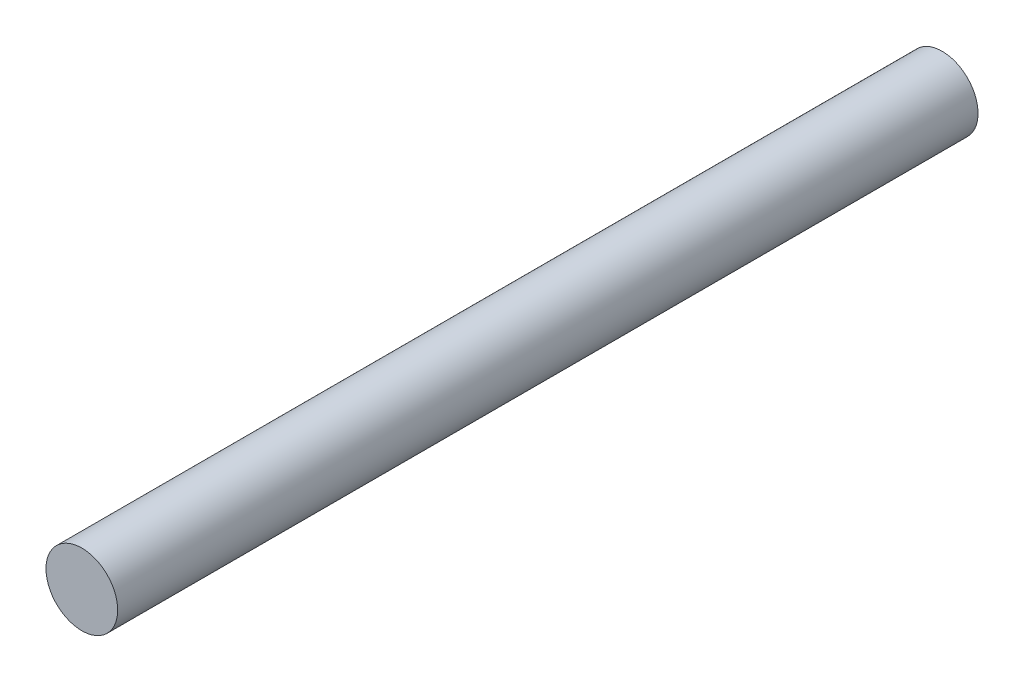
ISO-10303-21;
HEADER;
FILE_DESCRIPTION(('STEP AP214'),'2;1');
FILE_NAME('part.step','',(''),(''),'','','');
FILE_SCHEMA(('AUTOMOTIVE_DESIGN { 1 0 10303 214 1 1 1 1 }'));
ENDSEC;
DATA;
#1=APPLICATION_CONTEXT('core data for automotive mechanical design processes');
#2=APPLICATION_PROTOCOL_DEFINITION('international standard','automotive_design',2000,#1);
#3=PRODUCT_CONTEXT('',#1,'mechanical');
#4=PRODUCT('Part','Part','',(#3));
#5=PRODUCT_RELATED_PRODUCT_CATEGORY('part','',(#4));
#6=PRODUCT_DEFINITION_FORMATION('','',#4);
#7=PRODUCT_DEFINITION_CONTEXT('part definition',#1,'design');
#8=PRODUCT_DEFINITION('design','',#6,#7);
#9=PRODUCT_DEFINITION_SHAPE('','',#8);
#10=(LENGTH_UNIT() NAMED_UNIT(*) SI_UNIT(.MILLI.,.METRE.));
#11=(NAMED_UNIT(*) PLANE_ANGLE_UNIT() SI_UNIT($,.RADIAN.));
#12=(NAMED_UNIT(*) SI_UNIT($,.STERADIAN.) SOLID_ANGLE_UNIT());
#13=UNCERTAINTY_MEASURE_WITH_UNIT(LENGTH_MEASURE(1.E-05),#10,'distance_accuracy_value','');
#14=(GEOMETRIC_REPRESENTATION_CONTEXT(3) GLOBAL_UNCERTAINTY_ASSIGNED_CONTEXT((#13)) GLOBAL_UNIT_ASSIGNED_CONTEXT((#10,
#11,#12)) REPRESENTATION_CONTEXT('',''));
#15=CARTESIAN_POINT('',(0.,0.,0.));
#16=DIRECTION('',(0.,0.,1.));
#17=DIRECTION('',(1.,0.,0.));
#18=AXIS2_PLACEMENT_3D('',#15,#16,#17);
#19=CARTESIAN_POINT('',(0.,0.,42.));
#20=DIRECTION('',(0.,0.,-1.));
#21=DIRECTION('',(-1.,0.,0.));
#22=AXIS2_PLACEMENT_3D('',#19,#20,#21);
#23=CYLINDRICAL_SURFACE('',#22,1.75);
#24=CARTESIAN_POINT('',(0.,0.,42.));
#25=DIRECTION('',(0.,0.,1.));
#26=DIRECTION('',(1.,0.,0.));
#27=AXIS2_PLACEMENT_3D('',#24,#25,#26);
#28=CIRCLE('',#27,1.75);
#29=CARTESIAN_POINT('',(-1.75,0.,42.));
#30=VERTEX_POINT('',#29);
#31=EDGE_CURVE('E10',#30,#30,#28,.T.);
#32=CARTESIAN_POINT('',(0.,0.,0.));
#33=DIRECTION('',(0.,0.,1.));
#34=DIRECTION('',(1.,0.,0.));
#35=AXIS2_PLACEMENT_3D('',#32,#33,#34);
#36=CIRCLE('',#35,1.75);
#37=CARTESIAN_POINT('',(-1.75,0.,0.));
#38=VERTEX_POINT('',#37);
#39=EDGE_CURVE('E38',#38,#38,#36,.T.);
#40=CARTESIAN_POINT('',(-1.75,0.,42.));
#41=CARTESIAN_POINT('',(-1.75,0.,41.5625));
#42=CARTESIAN_POINT('',(-1.75,0.,41.125));
#43=CARTESIAN_POINT('',(-1.75,0.,40.25));
#44=CARTESIAN_POINT('',(-1.75,0.,39.8125));
#45=CARTESIAN_POINT('',(-1.75,0.,38.9375));
#46=CARTESIAN_POINT('',(-1.75,0.,38.5));
#47=CARTESIAN_POINT('',(-1.75,0.,37.625));
#48=CARTESIAN_POINT('',(-1.75,0.,37.1875));
#49=CARTESIAN_POINT('',(-1.75,0.,36.3125));
#50=CARTESIAN_POINT('',(-1.75,0.,35.875));
#51=CARTESIAN_POINT('',(-1.75,0.,35.));
#52=CARTESIAN_POINT('',(-1.75,0.,34.5625));
#53=CARTESIAN_POINT('',(-1.75,0.,33.6875));
#54=CARTESIAN_POINT('',(-1.75,0.,33.25));
#55=CARTESIAN_POINT('',(-1.75,0.,32.375));
#56=CARTESIAN_POINT('',(-1.75,0.,31.9375));
#57=CARTESIAN_POINT('',(-1.75,0.,31.0625));
#58=CARTESIAN_POINT('',(-1.75,0.,30.625));
#59=CARTESIAN_POINT('',(-1.75,0.,29.75));
#60=CARTESIAN_POINT('',(-1.75,0.,29.3125));
#61=CARTESIAN_POINT('',(-1.75,0.,28.4375));
#62=CARTESIAN_POINT('',(-1.75,0.,28.));
#63=CARTESIAN_POINT('',(-1.75,0.,27.125));
#64=CARTESIAN_POINT('',(-1.75,0.,26.6875));
#65=CARTESIAN_POINT('',(-1.75,0.,25.8125));
#66=CARTESIAN_POINT('',(-1.75,0.,25.375));
#67=CARTESIAN_POINT('',(-1.75,0.,24.5));
#68=CARTESIAN_POINT('',(-1.75,0.,24.0625));
#69=CARTESIAN_POINT('',(-1.75,0.,23.1875));
#70=CARTESIAN_POINT('',(-1.75,0.,22.75));
#71=CARTESIAN_POINT('',(-1.75,0.,21.875));
#72=CARTESIAN_POINT('',(-1.75,0.,21.4375));
#73=CARTESIAN_POINT('',(-1.75,0.,20.5625));
#74=CARTESIAN_POINT('',(-1.75,0.,20.125));
#75=CARTESIAN_POINT('',(-1.75,0.,19.25));
#76=CARTESIAN_POINT('',(-1.75,0.,18.8125));
#77=CARTESIAN_POINT('',(-1.75,0.,17.9375));
#78=CARTESIAN_POINT('',(-1.75,0.,17.5));
#79=CARTESIAN_POINT('',(-1.75,0.,16.625));
#80=CARTESIAN_POINT('',(-1.75,0.,16.1875));
#81=CARTESIAN_POINT('',(-1.75,0.,15.3125));
#82=CARTESIAN_POINT('',(-1.75,0.,14.875));
#83=CARTESIAN_POINT('',(-1.75,0.,14.));
#84=CARTESIAN_POINT('',(-1.75,0.,13.5625));
#85=CARTESIAN_POINT('',(-1.75,0.,12.6875));
#86=CARTESIAN_POINT('',(-1.75,0.,12.25));
#87=CARTESIAN_POINT('',(-1.75,0.,11.375));
#88=CARTESIAN_POINT('',(-1.75,0.,10.9375));
#89=CARTESIAN_POINT('',(-1.75,0.,10.0625));
#90=CARTESIAN_POINT('',(-1.75,0.,9.625));
#91=CARTESIAN_POINT('',(-1.75,0.,8.75));
#92=CARTESIAN_POINT('',(-1.75,0.,8.3125));
#93=CARTESIAN_POINT('',(-1.75,0.,7.4375));
#94=CARTESIAN_POINT('',(-1.75,0.,7.));
#95=CARTESIAN_POINT('',(-1.75,0.,6.125));
#96=CARTESIAN_POINT('',(-1.75,0.,5.6875));
#97=CARTESIAN_POINT('',(-1.75,0.,4.8125));
#98=CARTESIAN_POINT('',(-1.75,0.,4.375));
#99=CARTESIAN_POINT('',(-1.75,0.,3.5));
#100=CARTESIAN_POINT('',(-1.75,0.,3.0625));
#101=CARTESIAN_POINT('',(-1.75,0.,2.1875));
#102=CARTESIAN_POINT('',(-1.75,0.,1.75));
#103=CARTESIAN_POINT('',(-1.75,0.,0.875000000000001));
#104=CARTESIAN_POINT('',(-1.75,0.,0.4375));
#105=CARTESIAN_POINT('',(-1.75,0.,0.));
#106=B_SPLINE_CURVE_WITH_KNOTS('',3,(#40,#41,#42,#43,#44,#45,#46,#47,#48,#49,#50,#51,#52,#53,
#54,#55,#56,#57,#58,#59,#60,#61,#62,#63,#64,#65,#66,#67,#68,#69,#70,#71,#72,#73,#74,#75,#76,#77,
#78,#79,#80,#81,#82,#83,#84,#85,#86,#87,#88,#89,#90,#91,#92,#93,#94,#95,#96,#97,#98,#99,#100,
#101,#102,#103,#104,#105),.UNSPECIFIED.,.F.,.F.,(4,2,2,2,2,2,2,2,2,2,2,2,2,2,2,2,2,2,2,2,2,2,2,
2,2,2,2,2,2,2,2,2,4),(0.,1.3125,2.625,3.9375,5.25,6.56250000000001,7.875,9.1875,10.5,11.8125,
13.125,14.4375,15.75,17.0625,18.375,19.6875,21.,22.3125,23.625,24.9375,26.25,27.5625,28.875,
30.1875,31.5,32.8125,34.125,35.4375,36.75,38.0625,39.375,40.6875,42.),.UNSPECIFIED.);
#107=EDGE_CURVE('BSEAM35',#30,#38,#106,.T.);
#108=ORIENTED_EDGE('',*,*,#31,.F.);
#109=ORIENTED_EDGE('',*,*,#39,.T.);
#110=ORIENTED_EDGE('',*,*,#107,.T.);
#111=ORIENTED_EDGE('',*,*,#107,.F.);
#112=EDGE_LOOP('',(#108,#110,#109,#111));
#113=FACE_BOUND('',#112,.T.);
#114=ADVANCED_FACE('F35',(#113),#23,.T.);
#115=CARTESIAN_POINT('',(0.,0.,42.));
#116=DIRECTION('',(0.,0.,1.));
#117=DIRECTION('',(1.,0.,0.));
#118=AXIS2_PLACEMENT_3D('',#115,#116,#117);
#119=PLANE('',#118);
#120=ORIENTED_EDGE('',*,*,#31,.T.);
#121=EDGE_LOOP('',(#120));
#122=FACE_BOUND('',#121,.T.);
#123=ADVANCED_FACE('F50',(#122),#119,.T.);
#124=CARTESIAN_POINT('',(0.,0.,0.));
#125=DIRECTION('',(0.,0.,1.));
#126=DIRECTION('',(1.,0.,0.));
#127=AXIS2_PLACEMENT_3D('',#124,#125,#126);
#128=PLANE('',#127);
#129=ORIENTED_EDGE('',*,*,#39,.F.);
#130=EDGE_LOOP('',(#129));
#131=FACE_BOUND('',#130,.T.);
#132=ADVANCED_FACE('F48',(#131),#128,.F.);
#133=CLOSED_SHELL('',(#114,#123,#132));
#134=MANIFOLD_SOLID_BREP('B2',#133);
#135=ADVANCED_BREP_SHAPE_REPRESENTATION('',(#18,#134),#14);
#136=SHAPE_DEFINITION_REPRESENTATION(#9,#135);
ENDSEC;
END-ISO-10303-21;
